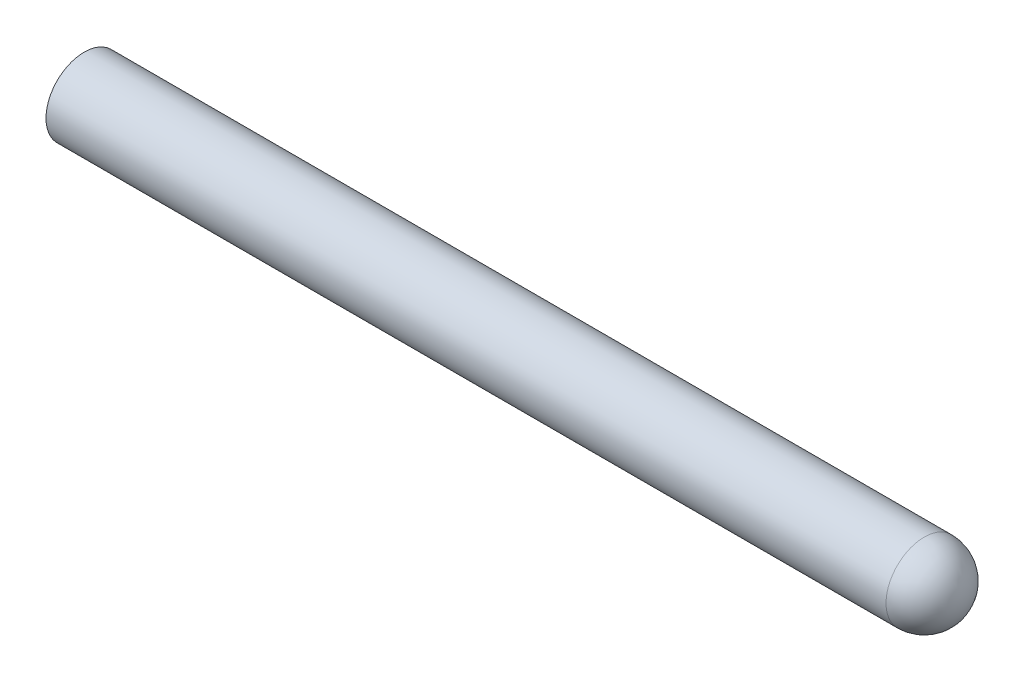
ISO-10303-21;
HEADER;
FILE_DESCRIPTION(('STEP AP214'),'2;1');
FILE_NAME('part.step','',(''),(''),'','','');
FILE_SCHEMA(('AUTOMOTIVE_DESIGN { 1 0 10303 214 1 1 1 1 }'));
ENDSEC;
DATA;
#1=APPLICATION_CONTEXT('core data for automotive mechanical design processes');
#2=APPLICATION_PROTOCOL_DEFINITION('international standard','automotive_design',2000,#1);
#3=PRODUCT_CONTEXT('',#1,'mechanical');
#4=PRODUCT('Part','Part','',(#3));
#5=PRODUCT_RELATED_PRODUCT_CATEGORY('part','',(#4));
#6=PRODUCT_DEFINITION_FORMATION('','',#4);
#7=PRODUCT_DEFINITION_CONTEXT('part definition',#1,'design');
#8=PRODUCT_DEFINITION('design','',#6,#7);
#9=PRODUCT_DEFINITION_SHAPE('','',#8);
#10=(LENGTH_UNIT() NAMED_UNIT(*) SI_UNIT(.MILLI.,.METRE.));
#11=(NAMED_UNIT(*) PLANE_ANGLE_UNIT() SI_UNIT($,.RADIAN.));
#12=(NAMED_UNIT(*) SI_UNIT($,.STERADIAN.) SOLID_ANGLE_UNIT());
#13=UNCERTAINTY_MEASURE_WITH_UNIT(LENGTH_MEASURE(1.E-05),#10,'distance_accuracy_value','');
#14=(GEOMETRIC_REPRESENTATION_CONTEXT(3) GLOBAL_UNCERTAINTY_ASSIGNED_CONTEXT((#13)) GLOBAL_UNIT_ASSIGNED_CONTEXT((#10,
#11,#12)) REPRESENTATION_CONTEXT('',''));
#15=CARTESIAN_POINT('',(0.,0.,0.));
#16=DIRECTION('',(0.,0.,1.));
#17=DIRECTION('',(1.,0.,0.));
#18=AXIS2_PLACEMENT_3D('',#15,#16,#17);
#19=CARTESIAN_POINT('',(355.6,0.,0.));
#20=DIRECTION('',(-1.,0.,0.));
#21=DIRECTION('',(0.,0.,1.));
#22=AXIS2_PLACEMENT_3D('',#19,#20,#21);
#23=CYLINDRICAL_SURFACE('',#22,19.05);
#24=CARTESIAN_POINT('',(355.6,0.,0.));
#25=DIRECTION('',(1.,0.,0.));
#26=DIRECTION('',(0.,0.,-1.));
#27=AXIS2_PLACEMENT_3D('',#24,#25,#26);
#28=CIRCLE('',#27,19.05);
#29=CARTESIAN_POINT('',(355.6,0.,-19.05));
#30=VERTEX_POINT('',#29);
#31=EDGE_CURVE('E10',#30,#30,#28,.T.);
#32=ORIENTED_EDGE('',*,*,#31,.F.);
#33=EDGE_LOOP('',(#32));
#34=FACE_BOUND('',#33,.T.);
#35=CARTESIAN_POINT('',(-63.5,0.,0.));
#36=DIRECTION('',(-1.,0.,0.));
#37=DIRECTION('',(0.,0.,1.));
#38=AXIS2_PLACEMENT_3D('',#35,#36,#37);
#39=CIRCLE('',#38,19.05);
#40=CARTESIAN_POINT('',(-63.5,0.,19.05));
#41=VERTEX_POINT('',#40);
#42=EDGE_CURVE('E47',#41,#41,#39,.T.);
#43=ORIENTED_EDGE('',*,*,#42,.F.);
#44=EDGE_LOOP('',(#43));
#45=FACE_BOUND('',#44,.T.);
#46=ADVANCED_FACE('F33',(#34,#45),#23,.T.);
#47=CARTESIAN_POINT('',(355.6,0.,0.));
#48=DIRECTION('',(-1.,0.,0.));
#49=DIRECTION('',(0.,1.,0.));
#50=AXIS2_PLACEMENT_3D('',#47,#48,#49);
#51=SPHERICAL_SURFACE('',#50,19.05);
#52=ORIENTED_EDGE('',*,*,#31,.T.);
#53=EDGE_LOOP('',(#52));
#54=FACE_BOUND('',#53,.T.);
#55=ADVANCED_FACE('F73',(#54),#51,.T.);
#56=CARTESIAN_POINT('',(0.,0.,0.));
#57=DIRECTION('',(-1.,0.,0.));
#58=DIRECTION('',(0.,0.,1.));
#59=AXIS2_PLACEMENT_3D('',#56,#57,#58);
#60=PLANE('',#59);
#61=CARTESIAN_POINT('',(0.,0.,0.));
#62=DIRECTION('',(-1.,0.,0.));
#63=DIRECTION('',(0.,0.,1.));
#64=AXIS2_PLACEMENT_3D('',#61,#62,#63);
#65=CIRCLE('',#64,9.525);
#66=CARTESIAN_POINT('',(0.,0.,9.525));
#67=VERTEX_POINT('',#66);
#68=EDGE_CURVE('E53',#67,#67,#65,.T.);
#69=ORIENTED_EDGE('',*,*,#68,.T.);
#70=EDGE_LOOP('',(#69));
#71=FACE_BOUND('',#70,.T.);
#72=CARTESIAN_POINT('',(0.,0.,0.));
#73=DIRECTION('',(1.,0.,0.));
#74=DIRECTION('',(0.,0.,-1.));
#75=AXIS2_PLACEMENT_3D('',#72,#73,#74);
#76=CIRCLE('',#75,12.7);
#77=CARTESIAN_POINT('',(0.,0.,-12.7));
#78=VERTEX_POINT('',#77);
#79=EDGE_CURVE('E39',#78,#78,#76,.T.);
#80=ORIENTED_EDGE('',*,*,#79,.T.);
#81=EDGE_LOOP('',(#80));
#82=FACE_BOUND('',#81,.T.);
#83=ADVANCED_FACE('F64',(#71,#82),#60,.F.);
#84=CARTESIAN_POINT('',(-63.5,0.,0.));
#85=DIRECTION('',(-1.,0.,0.));
#86=DIRECTION('',(0.,0.,1.));
#87=AXIS2_PLACEMENT_3D('',#84,#85,#86);
#88=PLANE('',#87);
#89=ORIENTED_EDGE('',*,*,#42,.T.);
#90=EDGE_LOOP('',(#89));
#91=FACE_BOUND('',#90,.T.);
#92=CARTESIAN_POINT('',(-63.5,0.,0.));
#93=DIRECTION('',(-1.,0.,0.));
#94=DIRECTION('',(0.,0.,1.));
#95=AXIS2_PLACEMENT_3D('',#92,#93,#94);
#96=CIRCLE('',#95,9.525);
#97=CARTESIAN_POINT('',(-63.5,0.,9.525));
#98=VERTEX_POINT('',#97);
#99=EDGE_CURVE('E52',#98,#98,#96,.T.);
#100=ORIENTED_EDGE('',*,*,#99,.F.);
#101=EDGE_LOOP('',(#100));
#102=FACE_BOUND('',#101,.T.);
#103=ADVANCED_FACE('F62',(#91,#102),#88,.T.);
#104=CARTESIAN_POINT('',(-63.5,0.,0.));
#105=DIRECTION('',(1.,0.,0.));
#106=DIRECTION('',(0.,0.,-1.));
#107=AXIS2_PLACEMENT_3D('',#104,#105,#106);
#108=CYLINDRICAL_SURFACE('',#107,9.525);
#109=ORIENTED_EDGE('',*,*,#99,.T.);
#110=EDGE_LOOP('',(#109));
#111=FACE_BOUND('',#110,.T.);
#112=ORIENTED_EDGE('',*,*,#68,.F.);
#113=EDGE_LOOP('',(#112));
#114=FACE_BOUND('',#113,.T.);
#115=ADVANCED_FACE('F59',(#111,#114),#108,.F.);
#116=CARTESIAN_POINT('',(355.6,19.05,0.));
#117=DIRECTION('',(1.,0.,0.));
#118=DIRECTION('',(0.,1.,0.));
#119=AXIS2_PLACEMENT_3D('',#116,#117,#118);
#120=PLANE('',#119);
#121=CARTESIAN_POINT('',(355.6,0.,0.));
#122=DIRECTION('',(1.,0.,0.));
#123=DIRECTION('',(0.,1.,0.));
#124=AXIS2_PLACEMENT_3D('',#121,#122,#123);
#125=CIRCLE('',#124,12.7);
#126=CARTESIAN_POINT('',(355.6,12.7,0.));
#127=VERTEX_POINT('',#126);
#128=EDGE_CURVE('E43',#127,#127,#125,.T.);
#129=ORIENTED_EDGE('',*,*,#128,.F.);
#130=EDGE_LOOP('',(#129));
#131=FACE_BOUND('',#130,.T.);
#132=ADVANCED_FACE('F71',(#131),#120,.F.);
#133=CARTESIAN_POINT('',(355.6,0.,0.));
#134=DIRECTION('',(-1.,0.,0.));
#135=DIRECTION('',(0.,0.,1.));
#136=AXIS2_PLACEMENT_3D('',#133,#134,#135);
#137=CYLINDRICAL_SURFACE('',#136,12.7);
#138=ORIENTED_EDGE('',*,*,#128,.T.);
#139=EDGE_LOOP('',(#138));
#140=FACE_BOUND('',#139,.T.);
#141=ORIENTED_EDGE('',*,*,#79,.F.);
#142=EDGE_LOOP('',(#141));
#143=FACE_BOUND('',#142,.T.);
#144=ADVANCED_FACE('F88',(#140,#143),#137,.F.);
#145=CLOSED_SHELL('',(#46,#55,#83,#103,#115,#132,#144));
#146=MANIFOLD_SOLID_BREP('B2',#145);
#147=ADVANCED_BREP_SHAPE_REPRESENTATION('',(#18,#146),#14);
#148=SHAPE_DEFINITION_REPRESENTATION(#9,#147);
ENDSEC;
END-ISO-10303-21;
